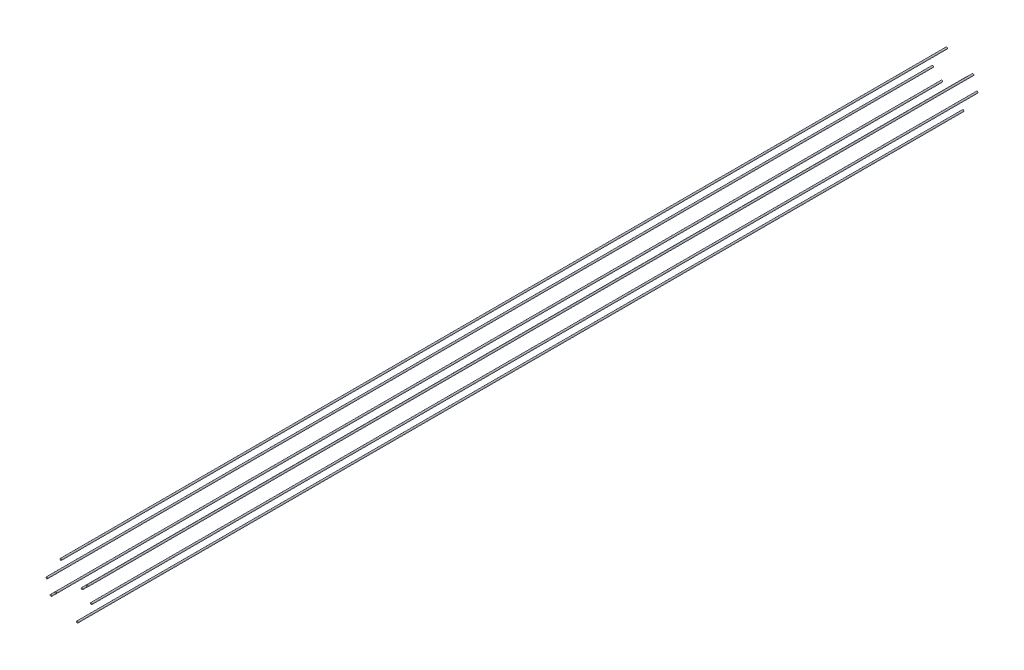
ISO-10303-21;
HEADER;
FILE_DESCRIPTION(('STEP AP214'),'2;1');
FILE_NAME('part.step','',(''),(''),'','','');
FILE_SCHEMA(('AUTOMOTIVE_DESIGN { 1 0 10303 214 1 1 1 1 }'));
ENDSEC;
DATA;
#1=APPLICATION_CONTEXT('core data for automotive mechanical design processes');
#2=APPLICATION_PROTOCOL_DEFINITION('international standard','automotive_design',2000,#1);
#3=PRODUCT_CONTEXT('',#1,'mechanical');
#4=PRODUCT('Part','Part','',(#3));
#5=PRODUCT_RELATED_PRODUCT_CATEGORY('part','',(#4));
#6=PRODUCT_DEFINITION_FORMATION('','',#4);
#7=PRODUCT_DEFINITION_CONTEXT('part definition',#1,'design');
#8=PRODUCT_DEFINITION('design','',#6,#7);
#9=PRODUCT_DEFINITION_SHAPE('','',#8);
#10=(LENGTH_UNIT() NAMED_UNIT(*) SI_UNIT(.MILLI.,.METRE.));
#11=(NAMED_UNIT(*) PLANE_ANGLE_UNIT() SI_UNIT($,.RADIAN.));
#12=(NAMED_UNIT(*) SI_UNIT($,.STERADIAN.) SOLID_ANGLE_UNIT());
#13=UNCERTAINTY_MEASURE_WITH_UNIT(LENGTH_MEASURE(1.E-05),#10,'distance_accuracy_value','');
#14=(GEOMETRIC_REPRESENTATION_CONTEXT(3) GLOBAL_UNCERTAINTY_ASSIGNED_CONTEXT((#13)) GLOBAL_UNIT_ASSIGNED_CONTEXT((#10,
#11,#12)) REPRESENTATION_CONTEXT('',''));
#15=CARTESIAN_POINT('',(0.,0.,0.));
#16=DIRECTION('',(0.,0.,1.));
#17=DIRECTION('',(1.,0.,0.));
#18=AXIS2_PLACEMENT_3D('',#15,#16,#17);
#19=CARTESIAN_POINT('',(-6.45919731041406,-30.8631781310866,531.04232846526));
#20=DIRECTION('',(0.,0.,1.));
#21=DIRECTION('',(1.,0.,0.));
#22=AXIS2_PLACEMENT_3D('',#19,#20,#21);
#23=PLANE('',#22);
#24=CARTESIAN_POINT('',(-6.45919731041406,-30.8631781310866,531.04232846526));
#25=DIRECTION('',(0.,0.,1.));
#26=DIRECTION('',(1.,0.,0.));
#27=AXIS2_PLACEMENT_3D('',#24,#25,#26);
#28=CIRCLE('',#27,0.500000000000001);
#29=CARTESIAN_POINT('',(-5.95919731041406,-30.8631781310866,531.04232846526));
#30=VERTEX_POINT('',#29);
#31=EDGE_CURVE('E12',#30,#30,#28,.T.);
#32=ORIENTED_EDGE('',*,*,#31,.T.);
#33=EDGE_LOOP('',(#32));
#34=FACE_BOUND('',#33,.T.);
#35=ADVANCED_FACE('F44',(#34),#23,.T.);
#36=CARTESIAN_POINT('',(-6.45919731041408,-30.8631781310866,297.));
#37=DIRECTION('',(0.,0.,1.));
#38=DIRECTION('',(1.,0.,0.));
#39=AXIS2_PLACEMENT_3D('',#36,#37,#38);
#40=CYLINDRICAL_SURFACE('',#39,0.500000000000001);
#41=ORIENTED_EDGE('',*,*,#31,.F.);
#42=EDGE_LOOP('',(#41));
#43=FACE_BOUND('',#42,.T.);
#44=CARTESIAN_POINT('',(-6.45919731041408,-30.8631781310866,-7.80000000000008));
#45=DIRECTION('',(0.,0.,-1.));
#46=DIRECTION('',(-1.,0.,0.));
#47=AXIS2_PLACEMENT_3D('',#44,#45,#46);
#48=CIRCLE('',#47,0.500000000000001);
#49=CARTESIAN_POINT('',(-6.95919731041408,-30.8631781310866,-7.80000000000008));
#50=VERTEX_POINT('',#49);
#51=EDGE_CURVE('E50',#50,#50,#48,.T.);
#52=ORIENTED_EDGE('',*,*,#51,.F.);
#53=EDGE_LOOP('',(#52));
#54=FACE_BOUND('',#53,.T.);
#55=ADVANCED_FACE('F54',(#43,#54),#40,.T.);
#56=CARTESIAN_POINT('',(-6.45919731041408,-30.8631781310866,-7.80000000000008));
#57=DIRECTION('',(0.,0.,-1.));
#58=DIRECTION('',(-1.,0.,0.));
#59=AXIS2_PLACEMENT_3D('',#56,#57,#58);
#60=PLANE('',#59);
#61=ORIENTED_EDGE('',*,*,#51,.T.);
#62=EDGE_LOOP('',(#61));
#63=FACE_BOUND('',#62,.T.);
#64=ADVANCED_FACE('F57',(#63),#60,.T.);
#65=CLOSED_SHELL('',(#35,#55,#64));
#66=MANIFOLD_SOLID_BREP('B2',#65);
#67=CARTESIAN_POINT('',(-14.9993848104141,-44.8631781310866,531.04232846526));
#68=DIRECTION('',(0.,0.,1.));
#69=DIRECTION('',(1.,0.,0.));
#70=AXIS2_PLACEMENT_3D('',#67,#68,#69);
#71=PLANE('',#70);
#72=CARTESIAN_POINT('',(-14.9993848104141,-44.8631781310866,531.04232846526));
#73=DIRECTION('',(0.,0.,1.));
#74=DIRECTION('',(1.,0.,0.));
#75=AXIS2_PLACEMENT_3D('',#72,#73,#74);
#76=CIRCLE('',#75,0.499999999999994);
#77=CARTESIAN_POINT('',(-14.4993848104141,-44.8631781310866,531.04232846526));
#78=VERTEX_POINT('',#77);
#79=EDGE_CURVE('E42',#78,#78,#76,.T.);
#80=ORIENTED_EDGE('',*,*,#79,.T.);
#81=EDGE_LOOP('',(#80));
#82=FACE_BOUND('',#81,.T.);
#83=ADVANCED_FACE('F98',(#82),#71,.T.);
#84=CARTESIAN_POINT('',(-14.9993848104141,-44.8631781310866,297.));
#85=DIRECTION('',(0.,0.,1.));
#86=DIRECTION('',(1.,0.,0.));
#87=AXIS2_PLACEMENT_3D('',#84,#85,#86);
#88=CYLINDRICAL_SURFACE('',#87,0.499999999999994);
#89=ORIENTED_EDGE('',*,*,#79,.F.);
#90=EDGE_LOOP('',(#89));
#91=FACE_BOUND('',#90,.T.);
#92=CARTESIAN_POINT('',(-14.9993848104141,-44.8631781310866,-7.80000000000008));
#93=DIRECTION('',(0.,0.,-1.));
#94=DIRECTION('',(-1.,0.,0.));
#95=AXIS2_PLACEMENT_3D('',#92,#93,#94);
#96=CIRCLE('',#95,0.499999999999994);
#97=CARTESIAN_POINT('',(-15.4993848104141,-44.8631781310866,-7.80000000000008));
#98=VERTEX_POINT('',#97);
#99=EDGE_CURVE('E104',#98,#98,#96,.T.);
#100=ORIENTED_EDGE('',*,*,#99,.F.);
#101=EDGE_LOOP('',(#100));
#102=FACE_BOUND('',#101,.T.);
#103=ADVANCED_FACE('F108',(#91,#102),#88,.T.);
#104=CARTESIAN_POINT('',(-14.9993848104141,-44.8631781310866,-7.80000000000008));
#105=DIRECTION('',(0.,0.,-1.));
#106=DIRECTION('',(-1.,0.,0.));
#107=AXIS2_PLACEMENT_3D('',#104,#105,#106);
#108=PLANE('',#107);
#109=ORIENTED_EDGE('',*,*,#99,.T.);
#110=EDGE_LOOP('',(#109));
#111=FACE_BOUND('',#110,.T.);
#112=ADVANCED_FACE('F111',(#111),#108,.T.);
#113=CLOSED_SHELL('',(#83,#103,#112));
#114=MANIFOLD_SOLID_BREP('B6',#113);
#115=CARTESIAN_POINT('',(-12.4591973104141,-52.8631781310866,531.04232846526));
#116=DIRECTION('',(0.,0.,1.));
#117=DIRECTION('',(1.,0.,0.));
#118=AXIS2_PLACEMENT_3D('',#115,#116,#117);
#119=PLANE('',#118);
#120=CARTESIAN_POINT('',(-12.4591973104141,-52.8631781310866,531.04232846526));
#121=DIRECTION('',(0.,0.,1.));
#122=DIRECTION('',(1.,0.,0.));
#123=AXIS2_PLACEMENT_3D('',#120,#121,#122);
#124=CIRCLE('',#123,0.499999999999998);
#125=CARTESIAN_POINT('',(-11.9591973104141,-52.8631781310866,531.04232846526));
#126=VERTEX_POINT('',#125);
#127=EDGE_CURVE('E96',#126,#126,#124,.T.);
#128=ORIENTED_EDGE('',*,*,#127,.T.);
#129=EDGE_LOOP('',(#128));
#130=FACE_BOUND('',#129,.T.);
#131=ADVANCED_FACE('F152',(#130),#119,.T.);
#132=CARTESIAN_POINT('',(-12.4591973104141,-52.8631781310867,297.));
#133=DIRECTION('',(0.,0.,1.));
#134=DIRECTION('',(1.,0.,0.));
#135=AXIS2_PLACEMENT_3D('',#132,#133,#134);
#136=CYLINDRICAL_SURFACE('',#135,0.499999999999998);
#137=ORIENTED_EDGE('',*,*,#127,.F.);
#138=EDGE_LOOP('',(#137));
#139=FACE_BOUND('',#138,.T.);
#140=CARTESIAN_POINT('',(-12.4591973104141,-52.8631781310867,-7.80000000000008));
#141=DIRECTION('',(0.,0.,-1.));
#142=DIRECTION('',(-1.,0.,0.));
#143=AXIS2_PLACEMENT_3D('',#140,#141,#142);
#144=CIRCLE('',#143,0.499999999999998);
#145=CARTESIAN_POINT('',(-12.9591973104141,-52.8631781310867,-7.80000000000008));
#146=VERTEX_POINT('',#145);
#147=EDGE_CURVE('E158',#146,#146,#144,.T.);
#148=ORIENTED_EDGE('',*,*,#147,.F.);
#149=EDGE_LOOP('',(#148));
#150=FACE_BOUND('',#149,.T.);
#151=ADVANCED_FACE('F162',(#139,#150),#136,.T.);
#152=CARTESIAN_POINT('',(-12.4591973104141,-52.8631781310867,-7.80000000000008));
#153=DIRECTION('',(0.,0.,-1.));
#154=DIRECTION('',(-1.,0.,0.));
#155=AXIS2_PLACEMENT_3D('',#152,#153,#154);
#156=PLANE('',#155);
#157=ORIENTED_EDGE('',*,*,#147,.T.);
#158=EDGE_LOOP('',(#157));
#159=FACE_BOUND('',#158,.T.);
#160=ADVANCED_FACE('F165',(#159),#156,.T.);
#161=CLOSED_SHELL('',(#131,#151,#160));
#162=MANIFOLD_SOLID_BREP('B36',#161);
#163=CARTESIAN_POINT('',(-9.45919731041407,-49.8631781310866,531.04232846526));
#164=DIRECTION('',(0.,0.,1.));
#165=DIRECTION('',(1.,0.,0.));
#166=AXIS2_PLACEMENT_3D('',#163,#164,#165);
#167=PLANE('',#166);
#168=CARTESIAN_POINT('',(-9.45919731041407,-49.8631781310866,531.04232846526));
#169=DIRECTION('',(0.,0.,1.));
#170=DIRECTION('',(1.,0.,0.));
#171=AXIS2_PLACEMENT_3D('',#168,#169,#170);
#172=CIRCLE('',#171,0.499999999999994);
#173=CARTESIAN_POINT('',(-8.95919731041407,-49.8631781310866,531.04232846526));
#174=VERTEX_POINT('',#173);
#175=EDGE_CURVE('E150',#174,#174,#172,.T.);
#176=ORIENTED_EDGE('',*,*,#175,.T.);
#177=EDGE_LOOP('',(#176));
#178=FACE_BOUND('',#177,.T.);
#179=ADVANCED_FACE('F206',(#178),#167,.T.);
#180=CARTESIAN_POINT('',(-9.45919731041408,-49.8631781310866,297.));
#181=DIRECTION('',(0.,0.,1.));
#182=DIRECTION('',(1.,0.,0.));
#183=AXIS2_PLACEMENT_3D('',#180,#181,#182);
#184=CYLINDRICAL_SURFACE('',#183,0.499999999999994);
#185=ORIENTED_EDGE('',*,*,#175,.F.);
#186=EDGE_LOOP('',(#185));
#187=FACE_BOUND('',#186,.T.);
#188=CARTESIAN_POINT('',(-9.45919731041408,-49.8631781310866,-7.80000000000008));
#189=DIRECTION('',(0.,0.,-1.));
#190=DIRECTION('',(-1.,0.,0.));
#191=AXIS2_PLACEMENT_3D('',#188,#189,#190);
#192=CIRCLE('',#191,0.499999999999994);
#193=CARTESIAN_POINT('',(-9.95919731041408,-49.8631781310866,-7.80000000000008));
#194=VERTEX_POINT('',#193);
#195=EDGE_CURVE('E212',#194,#194,#192,.T.);
#196=ORIENTED_EDGE('',*,*,#195,.F.);
#197=EDGE_LOOP('',(#196));
#198=FACE_BOUND('',#197,.T.);
#199=ADVANCED_FACE('F216',(#187,#198),#184,.T.);
#200=CARTESIAN_POINT('',(-9.45919731041408,-49.8631781310866,-7.80000000000008));
#201=DIRECTION('',(0.,0.,-1.));
#202=DIRECTION('',(-1.,0.,0.));
#203=AXIS2_PLACEMENT_3D('',#200,#201,#202);
#204=PLANE('',#203);
#205=ORIENTED_EDGE('',*,*,#195,.T.);
#206=EDGE_LOOP('',(#205));
#207=FACE_BOUND('',#206,.T.);
#208=ADVANCED_FACE('F219',(#207),#204,.T.);
#209=CLOSED_SHELL('',(#179,#199,#208));
#210=MANIFOLD_SOLID_BREP('B90',#209);
#211=CARTESIAN_POINT('',(3.54080268958593,-58.8631781310866,531.04232846526));
#212=DIRECTION('',(0.,0.,1.));
#213=DIRECTION('',(1.,0.,0.));
#214=AXIS2_PLACEMENT_3D('',#211,#212,#213);
#215=PLANE('',#214);
#216=CARTESIAN_POINT('',(3.54080268958593,-58.8631781310866,531.04232846526));
#217=DIRECTION('',(0.,0.,1.));
#218=DIRECTION('',(1.,0.,0.));
#219=AXIS2_PLACEMENT_3D('',#216,#217,#218);
#220=CIRCLE('',#219,0.500000000000001);
#221=CARTESIAN_POINT('',(4.04080268958593,-58.8631781310866,531.04232846526));
#222=VERTEX_POINT('',#221);
#223=EDGE_CURVE('E204',#222,#222,#220,.T.);
#224=ORIENTED_EDGE('',*,*,#223,.T.);
#225=EDGE_LOOP('',(#224));
#226=FACE_BOUND('',#225,.T.);
#227=ADVANCED_FACE('F260',(#226),#215,.T.);
#228=CARTESIAN_POINT('',(3.54080268958592,-58.8631781310866,297.));
#229=DIRECTION('',(0.,0.,1.));
#230=DIRECTION('',(1.,0.,0.));
#231=AXIS2_PLACEMENT_3D('',#228,#229,#230);
#232=CYLINDRICAL_SURFACE('',#231,0.500000000000001);
#233=ORIENTED_EDGE('',*,*,#223,.F.);
#234=EDGE_LOOP('',(#233));
#235=FACE_BOUND('',#234,.T.);
#236=CARTESIAN_POINT('',(3.54080268958592,-58.8631781310866,-7.80000000000008));
#237=DIRECTION('',(0.,0.,-1.));
#238=DIRECTION('',(-1.,0.,0.));
#239=AXIS2_PLACEMENT_3D('',#236,#237,#238);
#240=CIRCLE('',#239,0.500000000000001);
#241=CARTESIAN_POINT('',(3.04080268958592,-58.8631781310866,-7.80000000000008));
#242=VERTEX_POINT('',#241);
#243=EDGE_CURVE('E266',#242,#242,#240,.T.);
#244=ORIENTED_EDGE('',*,*,#243,.F.);
#245=EDGE_LOOP('',(#244));
#246=FACE_BOUND('',#245,.T.);
#247=ADVANCED_FACE('F270',(#235,#246),#232,.T.);
#248=CARTESIAN_POINT('',(3.54080268958592,-58.8631781310866,-7.80000000000008));
#249=DIRECTION('',(0.,0.,-1.));
#250=DIRECTION('',(-1.,0.,0.));
#251=AXIS2_PLACEMENT_3D('',#248,#249,#250);
#252=PLANE('',#251);
#253=ORIENTED_EDGE('',*,*,#243,.T.);
#254=EDGE_LOOP('',(#253));
#255=FACE_BOUND('',#254,.T.);
#256=ADVANCED_FACE('F273',(#255),#252,.T.);
#257=CLOSED_SHELL('',(#227,#247,#256));
#258=MANIFOLD_SOLID_BREP('B144',#257);
#259=CARTESIAN_POINT('',(12.0809901895859,-44.8631781310866,531.04232846526));
#260=DIRECTION('',(0.,0.,1.));
#261=DIRECTION('',(1.,0.,0.));
#262=AXIS2_PLACEMENT_3D('',#259,#260,#261);
#263=PLANE('',#262);
#264=CARTESIAN_POINT('',(12.0809901895859,-44.8631781310866,531.04232846526));
#265=DIRECTION('',(0.,0.,1.));
#266=DIRECTION('',(1.,0.,0.));
#267=AXIS2_PLACEMENT_3D('',#264,#265,#266);
#268=CIRCLE('',#267,0.499999999999994);
#269=CARTESIAN_POINT('',(12.5809901895859,-44.8631781310866,531.04232846526));
#270=VERTEX_POINT('',#269);
#271=EDGE_CURVE('E258',#270,#270,#268,.T.);
#272=ORIENTED_EDGE('',*,*,#271,.T.);
#273=EDGE_LOOP('',(#272));
#274=FACE_BOUND('',#273,.T.);
#275=ADVANCED_FACE('F314',(#274),#263,.T.);
#276=CARTESIAN_POINT('',(12.0809901895859,-44.8631781310866,297.));
#277=DIRECTION('',(0.,0.,1.));
#278=DIRECTION('',(1.,0.,0.));
#279=AXIS2_PLACEMENT_3D('',#276,#277,#278);
#280=CYLINDRICAL_SURFACE('',#279,0.499999999999994);
#281=ORIENTED_EDGE('',*,*,#271,.F.);
#282=EDGE_LOOP('',(#281));
#283=FACE_BOUND('',#282,.T.);
#284=CARTESIAN_POINT('',(12.0809901895859,-44.8631781310866,-7.80000000000008));
#285=DIRECTION('',(0.,0.,-1.));
#286=DIRECTION('',(-1.,0.,0.));
#287=AXIS2_PLACEMENT_3D('',#284,#285,#286);
#288=CIRCLE('',#287,0.499999999999994);
#289=CARTESIAN_POINT('',(11.5809901895859,-44.8631781310866,-7.80000000000008));
#290=VERTEX_POINT('',#289);
#291=EDGE_CURVE('E320',#290,#290,#288,.T.);
#292=ORIENTED_EDGE('',*,*,#291,.F.);
#293=EDGE_LOOP('',(#292));
#294=FACE_BOUND('',#293,.T.);
#295=ADVANCED_FACE('F324',(#283,#294),#280,.T.);
#296=CARTESIAN_POINT('',(12.0809901895859,-44.8631781310866,-7.80000000000008));
#297=DIRECTION('',(0.,0.,-1.));
#298=DIRECTION('',(-1.,0.,0.));
#299=AXIS2_PLACEMENT_3D('',#296,#297,#298);
#300=PLANE('',#299);
#301=ORIENTED_EDGE('',*,*,#291,.T.);
#302=EDGE_LOOP('',(#301));
#303=FACE_BOUND('',#302,.T.);
#304=ADVANCED_FACE('F327',(#303),#300,.T.);
#305=CLOSED_SHELL('',(#275,#295,#304));
#306=MANIFOLD_SOLID_BREP('B198',#305);
#307=CARTESIAN_POINT('',(6.41380268958594,-39.8631781310866,531.04232846526));
#308=DIRECTION('',(0.,0.,1.));
#309=DIRECTION('',(1.,0.,0.));
#310=AXIS2_PLACEMENT_3D('',#307,#308,#309);
#311=PLANE('',#310);
#312=CARTESIAN_POINT('',(6.41380268958594,-39.8631781310866,531.04232846526));
#313=DIRECTION('',(0.,0.,1.));
#314=DIRECTION('',(1.,0.,0.));
#315=AXIS2_PLACEMENT_3D('',#312,#313,#314);
#316=CIRCLE('',#315,0.500000000000001);
#317=CARTESIAN_POINT('',(6.91380268958594,-39.8631781310866,531.04232846526));
#318=VERTEX_POINT('',#317);
#319=EDGE_CURVE('E312',#318,#318,#316,.T.);
#320=ORIENTED_EDGE('',*,*,#319,.T.);
#321=EDGE_LOOP('',(#320));
#322=FACE_BOUND('',#321,.T.);
#323=ADVANCED_FACE('F367',(#322),#311,.T.);
#324=CARTESIAN_POINT('',(6.41380268958593,-39.8631781310866,297.));
#325=DIRECTION('',(0.,0.,1.));
#326=DIRECTION('',(1.,0.,0.));
#327=AXIS2_PLACEMENT_3D('',#324,#325,#326);
#328=CYLINDRICAL_SURFACE('',#327,0.500000000000001);
#329=ORIENTED_EDGE('',*,*,#319,.F.);
#330=EDGE_LOOP('',(#329));
#331=FACE_BOUND('',#330,.T.);
#332=CARTESIAN_POINT('',(6.41380268958593,-39.8631781310866,-7.80000000000008));
#333=DIRECTION('',(0.,0.,-1.));
#334=DIRECTION('',(-1.,0.,0.));
#335=AXIS2_PLACEMENT_3D('',#332,#333,#334);
#336=CIRCLE('',#335,0.500000000000001);
#337=CARTESIAN_POINT('',(5.91380268958593,-39.8631781310866,-7.80000000000008));
#338=VERTEX_POINT('',#337);
#339=EDGE_CURVE('E373',#338,#338,#336,.T.);
#340=ORIENTED_EDGE('',*,*,#339,.F.);
#341=EDGE_LOOP('',(#340));
#342=FACE_BOUND('',#341,.T.);
#343=ADVANCED_FACE('F377',(#331,#342),#328,.T.);
#344=CARTESIAN_POINT('',(6.41380268958593,-39.8631781310866,-7.80000000000008));
#345=DIRECTION('',(0.,0.,-1.));
#346=DIRECTION('',(-1.,0.,0.));
#347=AXIS2_PLACEMENT_3D('',#344,#345,#346);
#348=PLANE('',#347);
#349=ORIENTED_EDGE('',*,*,#339,.T.);
#350=EDGE_LOOP('',(#349));
#351=FACE_BOUND('',#350,.T.);
#352=ADVANCED_FACE('F380',(#351),#348,.T.);
#353=CLOSED_SHELL('',(#323,#343,#352));
#354=MANIFOLD_SOLID_BREP('B252',#353);
#355=CARTESIAN_POINT('',(9.54080268958594,-36.8631781310866,531.04232846526));
#356=DIRECTION('',(0.,0.,1.));
#357=DIRECTION('',(1.,0.,0.));
#358=AXIS2_PLACEMENT_3D('',#355,#356,#357);
#359=PLANE('',#358);
#360=CARTESIAN_POINT('',(9.54080268958594,-36.8631781310866,531.04232846526));
#361=DIRECTION('',(0.,0.,1.));
#362=DIRECTION('',(1.,0.,0.));
#363=AXIS2_PLACEMENT_3D('',#360,#361,#362);
#364=CIRCLE('',#363,0.499999999999994);
#365=CARTESIAN_POINT('',(10.0408026895859,-36.8631781310866,531.04232846526));
#366=VERTEX_POINT('',#365);
#367=EDGE_CURVE('E365',#366,#366,#364,.T.);
#368=ORIENTED_EDGE('',*,*,#367,.T.);
#369=EDGE_LOOP('',(#368));
#370=FACE_BOUND('',#369,.T.);
#371=ADVANCED_FACE('F411',(#370),#359,.T.);
#372=CARTESIAN_POINT('',(9.54080268958592,-36.8631781310866,297.));
#373=DIRECTION('',(0.,0.,1.));
#374=DIRECTION('',(1.,0.,0.));
#375=AXIS2_PLACEMENT_3D('',#372,#373,#374);
#376=CYLINDRICAL_SURFACE('',#375,0.499999999999994);
#377=ORIENTED_EDGE('',*,*,#367,.F.);
#378=EDGE_LOOP('',(#377));
#379=FACE_BOUND('',#378,.T.);
#380=CARTESIAN_POINT('',(9.54080268958592,-36.8631781310866,-7.80000000000008));
#381=DIRECTION('',(0.,0.,-1.));
#382=DIRECTION('',(-1.,0.,0.));
#383=AXIS2_PLACEMENT_3D('',#380,#381,#382);
#384=CIRCLE('',#383,0.499999999999994);
#385=CARTESIAN_POINT('',(9.04080268958593,-36.8631781310866,-7.80000000000008));
#386=VERTEX_POINT('',#385);
#387=EDGE_CURVE('E417',#386,#386,#384,.T.);
#388=ORIENTED_EDGE('',*,*,#387,.F.);
#389=EDGE_LOOP('',(#388));
#390=FACE_BOUND('',#389,.T.);
#391=ADVANCED_FACE('F421',(#379,#390),#376,.T.);
#392=CARTESIAN_POINT('',(9.54080268958592,-36.8631781310866,-7.80000000000008));
#393=DIRECTION('',(0.,0.,-1.));
#394=DIRECTION('',(-1.,0.,0.));
#395=AXIS2_PLACEMENT_3D('',#392,#393,#394);
#396=PLANE('',#395);
#397=ORIENTED_EDGE('',*,*,#387,.T.);
#398=EDGE_LOOP('',(#397));
#399=FACE_BOUND('',#398,.T.);
#400=ADVANCED_FACE('F424',(#399),#396,.T.);
#401=CLOSED_SHELL('',(#371,#391,#400));
#402=MANIFOLD_SOLID_BREP('B306',#401);
#403=ADVANCED_BREP_SHAPE_REPRESENTATION('',(#18,#66,#114,#162,#210,#258,#306,#354,#402),#14);
#404=SHAPE_DEFINITION_REPRESENTATION(#9,#403);
ENDSEC;
END-ISO-10303-21;
